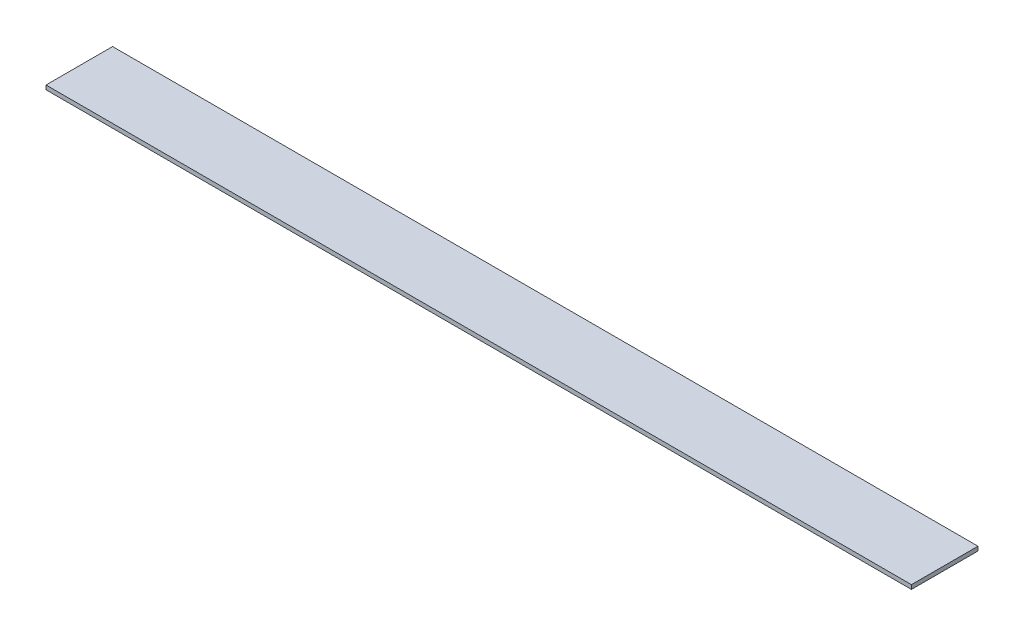
ISO-10303-21;
HEADER;
FILE_DESCRIPTION(('STEP AP214'),'2;1');
FILE_NAME('part.step','',(''),(''),'','','');
FILE_SCHEMA(('AUTOMOTIVE_DESIGN { 1 0 10303 214 1 1 1 1 }'));
ENDSEC;
DATA;
#1=APPLICATION_CONTEXT('core data for automotive mechanical design processes');
#2=APPLICATION_PROTOCOL_DEFINITION('international standard','automotive_design',2000,#1);
#3=PRODUCT_CONTEXT('',#1,'mechanical');
#4=PRODUCT('Part','Part','',(#3));
#5=PRODUCT_RELATED_PRODUCT_CATEGORY('part','',(#4));
#6=PRODUCT_DEFINITION_FORMATION('','',#4);
#7=PRODUCT_DEFINITION_CONTEXT('part definition',#1,'design');
#8=PRODUCT_DEFINITION('design','',#6,#7);
#9=PRODUCT_DEFINITION_SHAPE('','',#8);
#10=(LENGTH_UNIT() NAMED_UNIT(*) SI_UNIT(.MILLI.,.METRE.));
#11=(NAMED_UNIT(*) PLANE_ANGLE_UNIT() SI_UNIT($,.RADIAN.));
#12=(NAMED_UNIT(*) SI_UNIT($,.STERADIAN.) SOLID_ANGLE_UNIT());
#13=UNCERTAINTY_MEASURE_WITH_UNIT(LENGTH_MEASURE(1.E-05),#10,'distance_accuracy_value','');
#14=(GEOMETRIC_REPRESENTATION_CONTEXT(3) GLOBAL_UNCERTAINTY_ASSIGNED_CONTEXT((#13)) GLOBAL_UNIT_ASSIGNED_CONTEXT((#10,
#11,#12)) REPRESENTATION_CONTEXT('',''));
#15=CARTESIAN_POINT('',(0.,0.,0.));
#16=DIRECTION('',(0.,0.,1.));
#17=DIRECTION('',(1.,0.,0.));
#18=AXIS2_PLACEMENT_3D('',#15,#16,#17);
#19=CARTESIAN_POINT('',(0.,1.5875,0.));
#20=DIRECTION('',(1.,0.,0.));
#21=DIRECTION('',(0.,0.,-1.));
#22=AXIS2_PLACEMENT_3D('',#19,#20,#21);
#23=PLANE('',#22);
#24=DIRECTION('',(0.,0.,1.));
#25=VECTOR('',#24,1.);
#26=CARTESIAN_POINT('',(0.,0.,0.));
#27=LINE('',#26,#25);
#28=CARTESIAN_POINT('',(0.,0.,-25.4));
#29=VERTEX_POINT('',#28);
#30=CARTESIAN_POINT('',(0.,0.,0.));
#31=VERTEX_POINT('',#30);
#32=EDGE_CURVE('E99',#29,#31,#27,.T.);
#33=ORIENTED_EDGE('',*,*,#32,.T.);
#34=DIRECTION('',(0.,-1.,0.));
#35=VECTOR('',#34,1.);
#36=CARTESIAN_POINT('',(0.,1.5875,0.));
#37=LINE('',#36,#35);
#38=CARTESIAN_POINT('',(0.,1.5875,0.));
#39=VERTEX_POINT('',#38);
#40=EDGE_CURVE('E11',#39,#31,#37,.T.);
#41=ORIENTED_EDGE('',*,*,#40,.F.);
#42=DIRECTION('',(0.,0.,1.));
#43=VECTOR('',#42,1.);
#44=CARTESIAN_POINT('',(0.,1.5875,0.));
#45=LINE('',#44,#43);
#46=CARTESIAN_POINT('',(0.,1.5875,-25.4));
#47=VERTEX_POINT('',#46);
#48=EDGE_CURVE('E87',#47,#39,#45,.T.);
#49=ORIENTED_EDGE('',*,*,#48,.F.);
#50=DIRECTION('',(0.,-1.,0.));
#51=VECTOR('',#50,1.);
#52=CARTESIAN_POINT('',(0.,1.5875,-25.4));
#53=LINE('',#52,#51);
#54=EDGE_CURVE('E95',#47,#29,#53,.T.);
#55=ORIENTED_EDGE('',*,*,#54,.T.);
#56=EDGE_LOOP('',(#33,#41,#49,#55));
#57=FACE_BOUND('',#56,.T.);
#58=ADVANCED_FACE('F36',(#57),#23,.F.);
#59=CARTESIAN_POINT('',(0.,1.5875,0.));
#60=DIRECTION('',(0.,0.,-1.));
#61=DIRECTION('',(-1.,0.,0.));
#62=AXIS2_PLACEMENT_3D('',#59,#60,#61);
#63=PLANE('',#62);
#64=DIRECTION('',(1.,0.,0.));
#65=VECTOR('',#64,1.);
#66=CARTESIAN_POINT('',(0.,0.,0.));
#67=LINE('',#66,#65);
#68=CARTESIAN_POINT('',(330.2,0.,0.));
#69=VERTEX_POINT('',#68);
#70=EDGE_CURVE('E91',#31,#69,#67,.T.);
#71=ORIENTED_EDGE('',*,*,#70,.T.);
#72=DIRECTION('',(0.,-1.,0.));
#73=VECTOR('',#72,1.);
#74=CARTESIAN_POINT('',(330.2,1.5875,0.));
#75=LINE('',#74,#73);
#76=CARTESIAN_POINT('',(330.2,1.5875,0.));
#77=VERTEX_POINT('',#76);
#78=EDGE_CURVE('E44',#77,#69,#75,.T.);
#79=ORIENTED_EDGE('',*,*,#78,.F.);
#80=DIRECTION('',(1.,0.,0.));
#81=VECTOR('',#80,1.);
#82=CARTESIAN_POINT('',(0.,1.5875,0.));
#83=LINE('',#82,#81);
#84=EDGE_CURVE('E82',#39,#77,#83,.T.);
#85=ORIENTED_EDGE('',*,*,#84,.F.);
#86=ORIENTED_EDGE('',*,*,#40,.T.);
#87=EDGE_LOOP('',(#71,#79,#85,#86));
#88=FACE_BOUND('',#87,.T.);
#89=ADVANCED_FACE('F90',(#88),#63,.F.);
#90=CARTESIAN_POINT('',(330.2,1.5875,0.));
#91=DIRECTION('',(-1.,0.,0.));
#92=DIRECTION('',(0.,0.,1.));
#93=AXIS2_PLACEMENT_3D('',#90,#91,#92);
#94=PLANE('',#93);
#95=DIRECTION('',(0.,0.,-1.));
#96=VECTOR('',#95,1.);
#97=CARTESIAN_POINT('',(330.2,0.,0.));
#98=LINE('',#97,#96);
#99=CARTESIAN_POINT('',(330.2,0.,-25.4));
#100=VERTEX_POINT('',#99);
#101=EDGE_CURVE('E69',#69,#100,#98,.T.);
#102=ORIENTED_EDGE('',*,*,#101,.T.);
#103=DIRECTION('',(0.,-1.,0.));
#104=VECTOR('',#103,1.);
#105=CARTESIAN_POINT('',(330.2,1.5875,-25.4));
#106=LINE('',#105,#104);
#107=CARTESIAN_POINT('',(330.2,1.5875,-25.4));
#108=VERTEX_POINT('',#107);
#109=EDGE_CURVE('E92',#108,#100,#106,.T.);
#110=ORIENTED_EDGE('',*,*,#109,.F.);
#111=DIRECTION('',(0.,0.,-1.));
#112=VECTOR('',#111,1.);
#113=CARTESIAN_POINT('',(330.2,1.5875,0.));
#114=LINE('',#113,#112);
#115=EDGE_CURVE('E85',#77,#108,#114,.T.);
#116=ORIENTED_EDGE('',*,*,#115,.F.);
#117=ORIENTED_EDGE('',*,*,#78,.T.);
#118=EDGE_LOOP('',(#102,#110,#116,#117));
#119=FACE_BOUND('',#118,.T.);
#120=ADVANCED_FACE('F93',(#119),#94,.F.);
#121=CARTESIAN_POINT('',(0.,1.5875,-25.4));
#122=DIRECTION('',(0.,0.,1.));
#123=DIRECTION('',(1.,0.,0.));
#124=AXIS2_PLACEMENT_3D('',#121,#122,#123);
#125=PLANE('',#124);
#126=DIRECTION('',(-1.,0.,0.));
#127=VECTOR('',#126,1.);
#128=CARTESIAN_POINT('',(0.,0.,-25.4));
#129=LINE('',#128,#127);
#130=EDGE_CURVE('E75',#100,#29,#129,.T.);
#131=ORIENTED_EDGE('',*,*,#130,.T.);
#132=ORIENTED_EDGE('',*,*,#54,.F.);
#133=DIRECTION('',(-1.,0.,0.));
#134=VECTOR('',#133,1.);
#135=CARTESIAN_POINT('',(0.,1.5875,-25.4));
#136=LINE('',#135,#134);
#137=EDGE_CURVE('E52',#108,#47,#136,.T.);
#138=ORIENTED_EDGE('',*,*,#137,.F.);
#139=ORIENTED_EDGE('',*,*,#109,.T.);
#140=EDGE_LOOP('',(#131,#132,#138,#139));
#141=FACE_BOUND('',#140,.T.);
#142=ADVANCED_FACE('F106',(#141),#125,.F.);
#143=CARTESIAN_POINT('',(0.,1.5875,0.));
#144=DIRECTION('',(0.,-1.,0.));
#145=DIRECTION('',(0.,0.,-1.));
#146=AXIS2_PLACEMENT_3D('',#143,#144,#145);
#147=PLANE('',#146);
#148=ORIENTED_EDGE('',*,*,#48,.T.);
#149=ORIENTED_EDGE('',*,*,#84,.T.);
#150=ORIENTED_EDGE('',*,*,#115,.T.);
#151=ORIENTED_EDGE('',*,*,#137,.T.);
#152=EDGE_LOOP('',(#148,#149,#150,#151));
#153=FACE_BOUND('',#152,.T.);
#154=ADVANCED_FACE('F83',(#153),#147,.F.);
#155=CARTESIAN_POINT('',(0.,0.,0.));
#156=DIRECTION('',(0.,-1.,0.));
#157=DIRECTION('',(0.,0.,-1.));
#158=AXIS2_PLACEMENT_3D('',#155,#156,#157);
#159=PLANE('',#158);
#160=ORIENTED_EDGE('',*,*,#32,.F.);
#161=ORIENTED_EDGE('',*,*,#130,.F.);
#162=ORIENTED_EDGE('',*,*,#101,.F.);
#163=ORIENTED_EDGE('',*,*,#70,.F.);
#164=EDGE_LOOP('',(#160,#161,#162,#163));
#165=FACE_BOUND('',#164,.T.);
#166=ADVANCED_FACE('F109',(#165),#159,.T.);
#167=CLOSED_SHELL('',(#58,#89,#120,#142,#154,#166));
#168=MANIFOLD_SOLID_BREP('B2',#167);
#169=ADVANCED_BREP_SHAPE_REPRESENTATION('',(#18,#168),#14);
#170=SHAPE_DEFINITION_REPRESENTATION(#9,#169);
ENDSEC;
END-ISO-10303-21;
